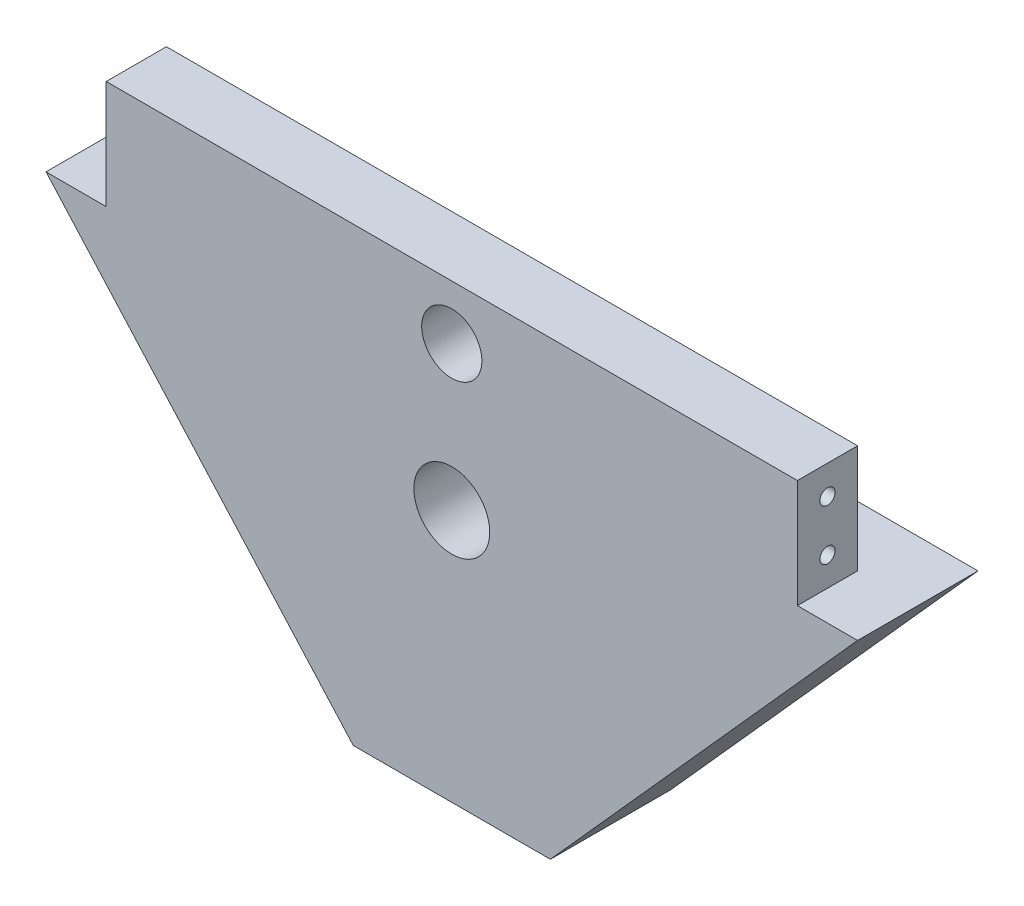
ISO-10303-21;
HEADER;
FILE_DESCRIPTION(('STEP AP214'),'2;1');
FILE_NAME('part.step','',(''),(''),'','','');
FILE_SCHEMA(('AUTOMOTIVE_DESIGN { 1 0 10303 214 1 1 1 1 }'));
ENDSEC;
DATA;
#1=APPLICATION_CONTEXT('core data for automotive mechanical design processes');
#2=APPLICATION_PROTOCOL_DEFINITION('international standard','automotive_design',2000,#1);
#3=PRODUCT_CONTEXT('',#1,'mechanical');
#4=PRODUCT('Part','Part','',(#3));
#5=PRODUCT_RELATED_PRODUCT_CATEGORY('part','',(#4));
#6=PRODUCT_DEFINITION_FORMATION('','',#4);
#7=PRODUCT_DEFINITION_CONTEXT('part definition',#1,'design');
#8=PRODUCT_DEFINITION('design','',#6,#7);
#9=PRODUCT_DEFINITION_SHAPE('','',#8);
#10=(LENGTH_UNIT() NAMED_UNIT(*) SI_UNIT(.MILLI.,.METRE.));
#11=(NAMED_UNIT(*) PLANE_ANGLE_UNIT() SI_UNIT($,.RADIAN.));
#12=(NAMED_UNIT(*) SI_UNIT($,.STERADIAN.) SOLID_ANGLE_UNIT());
#13=UNCERTAINTY_MEASURE_WITH_UNIT(LENGTH_MEASURE(1.E-05),#10,'distance_accuracy_value','');
#14=(GEOMETRIC_REPRESENTATION_CONTEXT(3) GLOBAL_UNCERTAINTY_ASSIGNED_CONTEXT((#13)) GLOBAL_UNIT_ASSIGNED_CONTEXT((#10,
#11,#12)) REPRESENTATION_CONTEXT('',''));
#15=CARTESIAN_POINT('',(0.,0.,0.));
#16=DIRECTION('',(0.,0.,1.));
#17=DIRECTION('',(1.,0.,0.));
#18=AXIS2_PLACEMENT_3D('',#15,#16,#17);
#19=CARTESIAN_POINT('',(-42.8001305488663,5.715,-12.7));
#20=DIRECTION('',(0.,1.,0.));
#21=DIRECTION('',(-1.,0.,0.));
#22=AXIS2_PLACEMENT_3D('',#19,#20,#21);
#23=PLANE('',#22);
#24=DIRECTION('',(0.,0.,-1.));
#25=VECTOR('',#24,1.);
#26=CARTESIAN_POINT('',(36.4501305488663,5.71500000000001,0.));
#27=LINE('',#26,#25);
#28=CARTESIAN_POINT('',(36.4501305488663,5.71500000000001,0.));
#29=VERTEX_POINT('',#28);
#30=CARTESIAN_POINT('',(36.4501305488663,5.71500000000001,-6.35));
#31=VERTEX_POINT('',#30);
#32=EDGE_CURVE('E168',#29,#31,#27,.T.);
#33=ORIENTED_EDGE('',*,*,#32,.T.);
#34=DIRECTION('',(1.,0.,0.));
#35=VECTOR('',#34,1.);
#36=CARTESIAN_POINT('',(-42.8001305488663,5.71500000000011,-6.35));
#37=LINE('',#36,#35);
#38=CARTESIAN_POINT('',(-36.4501305488663,5.71500000000001,-6.35));
#39=VERTEX_POINT('',#38);
#40=EDGE_CURVE('E186',#39,#31,#37,.T.);
#41=ORIENTED_EDGE('',*,*,#40,.F.);
#42=DIRECTION('',(0.,0.,-1.));
#43=VECTOR('',#42,1.);
#44=CARTESIAN_POINT('',(-36.4501305488663,5.71500000000001,0.));
#45=LINE('',#44,#43);
#46=CARTESIAN_POINT('',(-36.4501305488663,5.71500000000001,0.));
#47=VERTEX_POINT('',#46);
#48=EDGE_CURVE('E179',#47,#39,#45,.T.);
#49=ORIENTED_EDGE('',*,*,#48,.F.);
#50=DIRECTION('',(-1.,0.,0.));
#51=VECTOR('',#50,1.);
#52=CARTESIAN_POINT('',(-42.8001305488663,5.715,0.));
#53=LINE('',#52,#51);
#54=EDGE_CURVE('E204',#29,#47,#53,.T.);
#55=ORIENTED_EDGE('',*,*,#54,.F.);
#56=EDGE_LOOP('',(#33,#41,#49,#55));
#57=FACE_BOUND('',#56,.T.);
#58=ADVANCED_FACE('F44',(#57),#23,.T.);
#59=CARTESIAN_POINT('',(10.395398020278,-41.91,-12.7));
#60=DIRECTION('',(0.745039441543224,-0.667020412390026,0.));
#61=DIRECTION('',(0.667020412390026,0.745039441543224,0.));
#62=AXIS2_PLACEMENT_3D('',#59,#60,#61);
#63=PLANE('',#62);
#64=DIRECTION('',(0.667020412390026,0.745039441543224,0.));
#65=VECTOR('',#64,1.);
#66=CARTESIAN_POINT('',(10.395398020278,-41.91,0.));
#67=LINE('',#66,#65);
#68=CARTESIAN_POINT('',(10.395398020278,-41.91,0.));
#69=VERTEX_POINT('',#68);
#70=CARTESIAN_POINT('',(42.8001305488663,-5.71500000000001,0.));
#71=VERTEX_POINT('',#70);
#72=EDGE_CURVE('E215',#69,#71,#67,.T.);
#73=ORIENTED_EDGE('',*,*,#72,.F.);
#74=DIRECTION('',(0.,0.,1.));
#75=VECTOR('',#74,1.);
#76=CARTESIAN_POINT('',(10.395398020278,-41.91,-12.7));
#77=LINE('',#76,#75);
#78=CARTESIAN_POINT('',(10.395398020278,-41.91,-12.7));
#79=VERTEX_POINT('',#78);
#80=EDGE_CURVE('E53',#79,#69,#77,.T.);
#81=ORIENTED_EDGE('',*,*,#80,.F.);
#82=DIRECTION('',(0.667020412390026,0.745039441543224,0.));
#83=VECTOR('',#82,1.);
#84=CARTESIAN_POINT('',(10.395398020278,-41.91,-12.7));
#85=LINE('',#84,#83);
#86=CARTESIAN_POINT('',(42.8001305488663,-5.71500000000002,-12.7));
#87=VERTEX_POINT('',#86);
#88=EDGE_CURVE('E206',#79,#87,#85,.T.);
#89=ORIENTED_EDGE('',*,*,#88,.T.);
#90=DIRECTION('',(0.,0.,1.));
#91=VECTOR('',#90,1.);
#92=CARTESIAN_POINT('',(42.8001305488663,-5.71500000000002,-12.7));
#93=LINE('',#92,#91);
#94=EDGE_CURVE('E11',#87,#71,#93,.T.);
#95=ORIENTED_EDGE('',*,*,#94,.T.);
#96=EDGE_LOOP('',(#73,#81,#89,#95));
#97=FACE_BOUND('',#96,.T.);
#98=ADVANCED_FACE('F231',(#97),#63,.T.);
#99=CARTESIAN_POINT('',(-10.395398020278,-41.91,-12.7));
#100=DIRECTION('',(0.,-1.,0.));
#101=DIRECTION('',(0.,0.,-1.));
#102=AXIS2_PLACEMENT_3D('',#99,#100,#101);
#103=PLANE('',#102);
#104=DIRECTION('',(1.,0.,0.));
#105=VECTOR('',#104,1.);
#106=CARTESIAN_POINT('',(-10.395398020278,-41.91,0.));
#107=LINE('',#106,#105);
#108=CARTESIAN_POINT('',(-10.395398020278,-41.91,0.));
#109=VERTEX_POINT('',#108);
#110=EDGE_CURVE('E212',#109,#69,#107,.T.);
#111=ORIENTED_EDGE('',*,*,#110,.F.);
#112=DIRECTION('',(0.,0.,1.));
#113=VECTOR('',#112,1.);
#114=CARTESIAN_POINT('',(-10.395398020278,-41.91,-12.7));
#115=LINE('',#114,#113);
#116=CARTESIAN_POINT('',(-10.395398020278,-41.91,-12.7));
#117=VERTEX_POINT('',#116);
#118=EDGE_CURVE('E85',#117,#109,#115,.T.);
#119=ORIENTED_EDGE('',*,*,#118,.F.);
#120=DIRECTION('',(1.,0.,0.));
#121=VECTOR('',#120,1.);
#122=CARTESIAN_POINT('',(-10.395398020278,-41.91,-12.7));
#123=LINE('',#122,#121);
#124=EDGE_CURVE('E203',#117,#79,#123,.T.);
#125=ORIENTED_EDGE('',*,*,#124,.T.);
#126=ORIENTED_EDGE('',*,*,#80,.T.);
#127=EDGE_LOOP('',(#111,#119,#125,#126));
#128=FACE_BOUND('',#127,.T.);
#129=ADVANCED_FACE('F229',(#128),#103,.T.);
#130=CARTESIAN_POINT('',(-42.8001305488663,-5.71500000000003,-12.7));
#131=DIRECTION('',(-0.745039441543224,-0.667020412390026,0.));
#132=DIRECTION('',(0.667020412390026,-0.745039441543224,0.));
#133=AXIS2_PLACEMENT_3D('',#130,#131,#132);
#134=PLANE('',#133);
#135=DIRECTION('',(0.667020412390026,-0.745039441543224,0.));
#136=VECTOR('',#135,1.);
#137=CARTESIAN_POINT('',(-42.8001305488663,-5.71500000000003,0.));
#138=LINE('',#137,#136);
#139=CARTESIAN_POINT('',(-42.8001305488663,-5.71499999999993,0.));
#140=VERTEX_POINT('',#139);
#141=EDGE_CURVE('E199',#140,#109,#138,.T.);
#142=ORIENTED_EDGE('',*,*,#141,.F.);
#143=DIRECTION('',(0.,0.,1.));
#144=VECTOR('',#143,1.);
#145=CARTESIAN_POINT('',(-42.8001305488663,-5.71500000000003,-12.7));
#146=LINE('',#145,#144);
#147=CARTESIAN_POINT('',(-42.8001305488663,-5.71499999999991,-12.7));
#148=VERTEX_POINT('',#147);
#149=EDGE_CURVE('E209',#148,#140,#146,.T.);
#150=ORIENTED_EDGE('',*,*,#149,.F.);
#151=DIRECTION('',(0.667020412390026,-0.745039441543224,0.));
#152=VECTOR('',#151,1.);
#153=CARTESIAN_POINT('',(-42.8001305488663,-5.71500000000003,-12.7));
#154=LINE('',#153,#152);
#155=EDGE_CURVE('E200',#148,#117,#154,.T.);
#156=ORIENTED_EDGE('',*,*,#155,.T.);
#157=ORIENTED_EDGE('',*,*,#118,.T.);
#158=EDGE_LOOP('',(#142,#150,#156,#157));
#159=FACE_BOUND('',#158,.T.);
#160=ADVANCED_FACE('F46',(#159),#134,.T.);
#161=CARTESIAN_POINT('',(0.,0.,-12.7));
#162=DIRECTION('',(0.,0.,-1.));
#163=DIRECTION('',(-1.,0.,0.));
#164=AXIS2_PLACEMENT_3D('',#161,#162,#163);
#165=PLANE('',#164);
#166=CARTESIAN_POINT('',(0.,-15.24,-12.7));
#167=DIRECTION('',(0.,0.,1.));
#168=DIRECTION('',(1.,0.,0.));
#169=AXIS2_PLACEMENT_3D('',#166,#167,#168);
#170=CIRCLE('',#169,4.);
#171=CARTESIAN_POINT('',(4.,-15.24,-12.7));
#172=VERTEX_POINT('',#171);
#173=EDGE_CURVE('E183',#172,#172,#170,.T.);
#174=ORIENTED_EDGE('',*,*,#173,.T.);
#175=EDGE_LOOP('',(#174));
#176=FACE_BOUND('',#175,.T.);
#177=DIRECTION('',(1.,0.,0.));
#178=VECTOR('',#177,1.);
#179=CARTESIAN_POINT('',(-42.8001305488663,-5.71499999999991,-12.7));
#180=LINE('',#179,#178);
#181=EDGE_CURVE('E189',#148,#87,#180,.T.);
#182=ORIENTED_EDGE('',*,*,#181,.T.);
#183=ORIENTED_EDGE('',*,*,#88,.F.);
#184=ORIENTED_EDGE('',*,*,#124,.F.);
#185=ORIENTED_EDGE('',*,*,#155,.F.);
#186=EDGE_LOOP('',(#182,#183,#184,#185));
#187=FACE_BOUND('',#186,.T.);
#188=ADVANCED_FACE('F258',(#176,#187),#165,.T.);
#189=CARTESIAN_POINT('',(0.,0.,0.));
#190=DIRECTION('',(0.,0.,-1.));
#191=DIRECTION('',(-1.,0.,0.));
#192=AXIS2_PLACEMENT_3D('',#189,#190,#191);
#193=PLANE('',#192);
#194=CARTESIAN_POINT('',(0.,-15.24,0.));
#195=DIRECTION('',(0.,0.,1.));
#196=DIRECTION('',(1.,0.,0.));
#197=AXIS2_PLACEMENT_3D('',#194,#195,#196);
#198=CIRCLE('',#197,4.);
#199=CARTESIAN_POINT('',(4.,-15.24,0.));
#200=VERTEX_POINT('',#199);
#201=EDGE_CURVE('E171',#200,#200,#198,.T.);
#202=ORIENTED_EDGE('',*,*,#201,.F.);
#203=EDGE_LOOP('',(#202));
#204=FACE_BOUND('',#203,.T.);
#205=CARTESIAN_POINT('',(0.,0.,0.));
#206=DIRECTION('',(0.,0.,1.));
#207=DIRECTION('',(1.,0.,0.));
#208=AXIS2_PLACEMENT_3D('',#205,#206,#207);
#209=CIRCLE('',#208,3.175);
#210=CARTESIAN_POINT('',(3.175,0.,0.));
#211=VERTEX_POINT('',#210);
#212=EDGE_CURVE('E196',#211,#211,#209,.T.);
#213=ORIENTED_EDGE('',*,*,#212,.F.);
#214=EDGE_LOOP('',(#213));
#215=FACE_BOUND('',#214,.T.);
#216=DIRECTION('',(-1.,0.,0.));
#217=VECTOR('',#216,1.);
#218=CARTESIAN_POINT('',(42.8001305488663,-5.71500000000001,0.));
#219=LINE('',#218,#217);
#220=CARTESIAN_POINT('',(36.4501305488663,-5.71499999999992,0.));
#221=VERTEX_POINT('',#220);
#222=EDGE_CURVE('E158',#71,#221,#219,.T.);
#223=ORIENTED_EDGE('',*,*,#222,.T.);
#224=DIRECTION('',(0.,1.,0.));
#225=VECTOR('',#224,1.);
#226=CARTESIAN_POINT('',(36.4501305488663,5.71500000000001,0.));
#227=LINE('',#226,#225);
#228=EDGE_CURVE('E161',#221,#29,#227,.T.);
#229=ORIENTED_EDGE('',*,*,#228,.T.);
#230=ORIENTED_EDGE('',*,*,#54,.T.);
#231=DIRECTION('',(0.,-1.,0.));
#232=VECTOR('',#231,1.);
#233=CARTESIAN_POINT('',(-36.4501305488663,5.71500000000001,0.));
#234=LINE('',#233,#232);
#235=CARTESIAN_POINT('',(-36.4501305488663,-5.71499999999992,0.));
#236=VERTEX_POINT('',#235);
#237=EDGE_CURVE('E173',#47,#236,#234,.T.);
#238=ORIENTED_EDGE('',*,*,#237,.T.);
#239=DIRECTION('',(-1.,0.,0.));
#240=VECTOR('',#239,1.);
#241=CARTESIAN_POINT('',(-42.8001305488663,-5.71499999999993,0.));
#242=LINE('',#241,#240);
#243=EDGE_CURVE('E176',#236,#140,#242,.T.);
#244=ORIENTED_EDGE('',*,*,#243,.T.);
#245=ORIENTED_EDGE('',*,*,#141,.T.);
#246=ORIENTED_EDGE('',*,*,#110,.T.);
#247=ORIENTED_EDGE('',*,*,#72,.T.);
#248=EDGE_LOOP('',(#223,#229,#230,#238,#244,#245,#246,#247));
#249=FACE_BOUND('',#248,.T.);
#250=ADVANCED_FACE('F228',(#204,#215,#249),#193,.F.);
#251=CARTESIAN_POINT('',(0.,0.,-12.7));
#252=DIRECTION('',(0.,0.,1.));
#253=DIRECTION('',(1.,0.,0.));
#254=AXIS2_PLACEMENT_3D('',#251,#252,#253);
#255=CYLINDRICAL_SURFACE('',#254,3.175);
#256=CARTESIAN_POINT('',(0.,0.,-6.35));
#257=DIRECTION('',(0.,0.,1.));
#258=DIRECTION('',(0.,-1.,0.));
#259=AXIS2_PLACEMENT_3D('',#256,#257,#258);
#260=CIRCLE('',#259,3.175);
#261=CARTESIAN_POINT('',(0.,-3.175,-6.35));
#262=VERTEX_POINT('',#261);
#263=EDGE_CURVE('E48',#262,#262,#260,.F.);
#264=ORIENTED_EDGE('',*,*,#263,.T.);
#265=EDGE_LOOP('',(#264));
#266=FACE_BOUND('',#265,.T.);
#267=ORIENTED_EDGE('',*,*,#212,.T.);
#268=EDGE_LOOP('',(#267));
#269=FACE_BOUND('',#268,.T.);
#270=ADVANCED_FACE('F247',(#266,#269),#255,.F.);
#271=CARTESIAN_POINT('',(-42.8001305488663,5.71500000000011,-6.35));
#272=DIRECTION('',(0.,0.,1.));
#273=DIRECTION('',(0.,-1.,0.));
#274=AXIS2_PLACEMENT_3D('',#271,#272,#273);
#275=PLANE('',#274);
#276=ORIENTED_EDGE('',*,*,#40,.T.);
#277=DIRECTION('',(0.,1.,0.));
#278=VECTOR('',#277,1.);
#279=CARTESIAN_POINT('',(36.4501305488663,5.71500000000001,-6.35));
#280=LINE('',#279,#278);
#281=CARTESIAN_POINT('',(36.4501305488663,-5.71499999999991,-6.35));
#282=VERTEX_POINT('',#281);
#283=EDGE_CURVE('E162',#282,#31,#280,.T.);
#284=ORIENTED_EDGE('',*,*,#283,.F.);
#285=DIRECTION('',(1.,0.,0.));
#286=VECTOR('',#285,1.);
#287=CARTESIAN_POINT('',(-42.8001305488663,-5.71499999999991,-6.35));
#288=LINE('',#287,#286);
#289=CARTESIAN_POINT('',(-36.4501305488663,-5.71499999999992,-6.35));
#290=VERTEX_POINT('',#289);
#291=EDGE_CURVE('E191',#290,#282,#288,.T.);
#292=ORIENTED_EDGE('',*,*,#291,.F.);
#293=DIRECTION('',(0.,-1.,0.));
#294=VECTOR('',#293,1.);
#295=CARTESIAN_POINT('',(-36.4501305488663,5.71500000000001,-6.35));
#296=LINE('',#295,#294);
#297=EDGE_CURVE('E61',#39,#290,#296,.T.);
#298=ORIENTED_EDGE('',*,*,#297,.F.);
#299=EDGE_LOOP('',(#276,#284,#292,#298));
#300=FACE_BOUND('',#299,.T.);
#301=ORIENTED_EDGE('',*,*,#263,.F.);
#302=EDGE_LOOP('',(#301));
#303=FACE_BOUND('',#302,.T.);
#304=ADVANCED_FACE('F244',(#300,#303),#275,.F.);
#305=CARTESIAN_POINT('',(-42.8001305488663,-5.71499999999991,-12.7));
#306=DIRECTION('',(0.,-1.,0.));
#307=DIRECTION('',(1.,0.,0.));
#308=AXIS2_PLACEMENT_3D('',#305,#306,#307);
#309=PLANE('',#308);
#310=ORIENTED_EDGE('',*,*,#94,.F.);
#311=ORIENTED_EDGE('',*,*,#181,.F.);
#312=ORIENTED_EDGE('',*,*,#149,.T.);
#313=ORIENTED_EDGE('',*,*,#243,.F.);
#314=DIRECTION('',(0.,0.,-1.));
#315=VECTOR('',#314,1.);
#316=CARTESIAN_POINT('',(-36.4501305488663,-5.71499999999992,0.));
#317=LINE('',#316,#315);
#318=EDGE_CURVE('E167',#236,#290,#317,.T.);
#319=ORIENTED_EDGE('',*,*,#318,.T.);
#320=ORIENTED_EDGE('',*,*,#291,.T.);
#321=DIRECTION('',(0.,0.,-1.));
#322=VECTOR('',#321,1.);
#323=CARTESIAN_POINT('',(36.4501305488663,-5.71499999999992,0.));
#324=LINE('',#323,#322);
#325=EDGE_CURVE('E165',#221,#282,#324,.T.);
#326=ORIENTED_EDGE('',*,*,#325,.F.);
#327=ORIENTED_EDGE('',*,*,#222,.F.);
#328=EDGE_LOOP('',(#310,#311,#312,#313,#319,#320,#326,#327));
#329=FACE_BOUND('',#328,.T.);
#330=ADVANCED_FACE('F223',(#329),#309,.F.);
#331=CARTESIAN_POINT('',(0.,-15.24,-12.7));
#332=DIRECTION('',(0.,0.,1.));
#333=DIRECTION('',(1.,0.,0.));
#334=AXIS2_PLACEMENT_3D('',#331,#332,#333);
#335=CYLINDRICAL_SURFACE('',#334,4.);
#336=ORIENTED_EDGE('',*,*,#173,.F.);
#337=EDGE_LOOP('',(#336));
#338=FACE_BOUND('',#337,.T.);
#339=ORIENTED_EDGE('',*,*,#201,.T.);
#340=EDGE_LOOP('',(#339));
#341=FACE_BOUND('',#340,.T.);
#342=ADVANCED_FACE('F324',(#338,#341),#335,.F.);
#343=CARTESIAN_POINT('',(-36.4501305488663,5.71500000000001,0.));
#344=DIRECTION('',(1.,0.,0.));
#345=DIRECTION('',(0.,0.,-1.));
#346=AXIS2_PLACEMENT_3D('',#343,#344,#345);
#347=PLANE('',#346);
#348=CARTESIAN_POINT('',(-36.4501305488663,2.66700000000001,-3.175));
#349=DIRECTION('',(-1.,0.,0.));
#350=DIRECTION('',(0.,0.,1.));
#351=AXIS2_PLACEMENT_3D('',#348,#349,#350);
#352=CIRCLE('',#351,0.79999999999999);
#353=CARTESIAN_POINT('',(-36.4501305488663,2.66700000000001,-2.37500000000001));
#354=VERTEX_POINT('',#353);
#355=EDGE_CURVE('E146',#354,#354,#352,.T.);
#356=ORIENTED_EDGE('',*,*,#355,.F.);
#357=EDGE_LOOP('',(#356));
#358=FACE_BOUND('',#357,.T.);
#359=CARTESIAN_POINT('',(-36.4501305488663,-2.66699999999992,-3.175));
#360=DIRECTION('',(-1.,0.,0.));
#361=DIRECTION('',(0.,0.,1.));
#362=AXIS2_PLACEMENT_3D('',#359,#360,#361);
#363=CIRCLE('',#362,0.79999999999999);
#364=CARTESIAN_POINT('',(-36.4501305488663,-2.66699999999992,-2.37500000000001));
#365=VERTEX_POINT('',#364);
#366=EDGE_CURVE('E152',#365,#365,#363,.T.);
#367=ORIENTED_EDGE('',*,*,#366,.F.);
#368=EDGE_LOOP('',(#367));
#369=FACE_BOUND('',#368,.T.);
#370=ORIENTED_EDGE('',*,*,#297,.T.);
#371=ORIENTED_EDGE('',*,*,#318,.F.);
#372=ORIENTED_EDGE('',*,*,#237,.F.);
#373=ORIENTED_EDGE('',*,*,#48,.T.);
#374=EDGE_LOOP('',(#370,#371,#372,#373));
#375=FACE_BOUND('',#374,.T.);
#376=ADVANCED_FACE('F242',(#358,#369,#375),#347,.F.);
#377=CARTESIAN_POINT('',(36.4501305488663,5.71500000000001,0.));
#378=DIRECTION('',(-1.,0.,0.));
#379=DIRECTION('',(0.,-1.,0.));
#380=AXIS2_PLACEMENT_3D('',#377,#378,#379);
#381=PLANE('',#380);
#382=CARTESIAN_POINT('',(36.4501305488663,2.66700000000003,-3.175));
#383=DIRECTION('',(1.,0.,0.));
#384=DIRECTION('',(0.,0.,-1.));
#385=AXIS2_PLACEMENT_3D('',#382,#383,#384);
#386=CIRCLE('',#385,0.79999999999999);
#387=CARTESIAN_POINT('',(36.4501305488663,2.66700000000003,-3.97499999999999));
#388=VERTEX_POINT('',#387);
#389=EDGE_CURVE('E136',#388,#388,#386,.T.);
#390=ORIENTED_EDGE('',*,*,#389,.F.);
#391=EDGE_LOOP('',(#390));
#392=FACE_BOUND('',#391,.T.);
#393=CARTESIAN_POINT('',(36.4501305488663,-2.6669999999999,-3.175));
#394=DIRECTION('',(1.,0.,0.));
#395=DIRECTION('',(0.,0.,-1.));
#396=AXIS2_PLACEMENT_3D('',#393,#394,#395);
#397=CIRCLE('',#396,0.79999999999999);
#398=CARTESIAN_POINT('',(36.4501305488663,-2.6669999999999,-3.97499999999999));
#399=VERTEX_POINT('',#398);
#400=EDGE_CURVE('E135',#399,#399,#397,.T.);
#401=ORIENTED_EDGE('',*,*,#400,.F.);
#402=EDGE_LOOP('',(#401));
#403=FACE_BOUND('',#402,.T.);
#404=ORIENTED_EDGE('',*,*,#283,.T.);
#405=ORIENTED_EDGE('',*,*,#32,.F.);
#406=ORIENTED_EDGE('',*,*,#228,.F.);
#407=ORIENTED_EDGE('',*,*,#325,.T.);
#408=EDGE_LOOP('',(#404,#405,#406,#407));
#409=FACE_BOUND('',#408,.T.);
#410=ADVANCED_FACE('F237',(#392,#403,#409),#381,.F.);
#411=CARTESIAN_POINT('',(-31.1161305488663,-2.66699999999992,-3.175));
#412=DIRECTION('',(-1.,0.,0.));
#413=DIRECTION('',(0.,0.,1.));
#414=AXIS2_PLACEMENT_3D('',#411,#412,#413);
#415=CONICAL_SURFACE('',#414,0.799999999999988,1.02974425867665);
#416=CARTESIAN_POINT('',(-30.6354420536443,-2.66699999999992,-3.175));
#417=VERTEX_POINT('',#416);
#418=VERTEX_LOOP('',#417);
#419=FACE_BOUND('',#418,.T.);
#420=CARTESIAN_POINT('',(-31.1161305488663,-2.66699999999992,-3.175));
#421=DIRECTION('',(-1.,0.,0.));
#422=DIRECTION('',(0.,0.,1.));
#423=AXIS2_PLACEMENT_3D('',#420,#421,#422);
#424=CIRCLE('',#423,0.799999999999988);
#425=CARTESIAN_POINT('',(-31.1161305488663,-2.66699999999992,-2.37500000000001));
#426=VERTEX_POINT('',#425);
#427=EDGE_CURVE('E155',#426,#426,#424,.T.);
#428=ORIENTED_EDGE('',*,*,#427,.T.);
#429=EDGE_LOOP('',(#428));
#430=FACE_BOUND('',#429,.T.);
#431=ADVANCED_FACE('F352',(#419,#430),#415,.F.);
#432=CARTESIAN_POINT('',(-36.4501305488663,-2.66699999999992,-3.175));
#433=DIRECTION('',(-1.,0.,0.));
#434=DIRECTION('',(0.,0.,1.));
#435=AXIS2_PLACEMENT_3D('',#432,#433,#434);
#436=CYLINDRICAL_SURFACE('',#435,0.799999999999989);
#437=ORIENTED_EDGE('',*,*,#427,.F.);
#438=EDGE_LOOP('',(#437));
#439=FACE_BOUND('',#438,.T.);
#440=ORIENTED_EDGE('',*,*,#366,.T.);
#441=EDGE_LOOP('',(#440));
#442=FACE_BOUND('',#441,.T.);
#443=ADVANCED_FACE('F362',(#439,#442),#436,.F.);
#444=CARTESIAN_POINT('',(-31.1161305488663,2.66700000000001,-3.175));
#445=DIRECTION('',(-1.,0.,0.));
#446=DIRECTION('',(0.,0.,1.));
#447=AXIS2_PLACEMENT_3D('',#444,#445,#446);
#448=CONICAL_SURFACE('',#447,0.799999999999988,1.02974425867665);
#449=CARTESIAN_POINT('',(-30.6354420536443,2.66700000000001,-3.175));
#450=VERTEX_POINT('',#449);
#451=VERTEX_LOOP('',#450);
#452=FACE_BOUND('',#451,.T.);
#453=CARTESIAN_POINT('',(-31.1161305488663,2.66700000000001,-3.175));
#454=DIRECTION('',(-1.,0.,0.));
#455=DIRECTION('',(0.,0.,1.));
#456=AXIS2_PLACEMENT_3D('',#453,#454,#455);
#457=CIRCLE('',#456,0.799999999999988);
#458=CARTESIAN_POINT('',(-31.1161305488663,2.66700000000001,-2.37500000000001));
#459=VERTEX_POINT('',#458);
#460=EDGE_CURVE('E149',#459,#459,#457,.T.);
#461=ORIENTED_EDGE('',*,*,#460,.T.);
#462=EDGE_LOOP('',(#461));
#463=FACE_BOUND('',#462,.T.);
#464=ADVANCED_FACE('F370',(#452,#463),#448,.F.);
#465=CARTESIAN_POINT('',(-36.4501305488663,2.66700000000001,-3.175));
#466=DIRECTION('',(-1.,0.,0.));
#467=DIRECTION('',(0.,0.,1.));
#468=AXIS2_PLACEMENT_3D('',#465,#466,#467);
#469=CYLINDRICAL_SURFACE('',#468,0.799999999999989);
#470=ORIENTED_EDGE('',*,*,#460,.F.);
#471=EDGE_LOOP('',(#470));
#472=FACE_BOUND('',#471,.T.);
#473=ORIENTED_EDGE('',*,*,#355,.T.);
#474=EDGE_LOOP('',(#473));
#475=FACE_BOUND('',#474,.T.);
#476=ADVANCED_FACE('F379',(#472,#475),#469,.F.);
#477=CARTESIAN_POINT('',(31.1161305488663,-2.6669999999999,-3.175));
#478=DIRECTION('',(1.,0.,0.));
#479=DIRECTION('',(0.,0.,-1.));
#480=AXIS2_PLACEMENT_3D('',#477,#478,#479);
#481=CONICAL_SURFACE('',#480,0.799999999999988,1.02974425867665);
#482=CARTESIAN_POINT('',(30.6354420536443,-2.6669999999999,-3.175));
#483=VERTEX_POINT('',#482);
#484=VERTEX_LOOP('',#483);
#485=FACE_BOUND('',#484,.T.);
#486=CARTESIAN_POINT('',(31.1161305488663,-2.6669999999999,-3.175));
#487=DIRECTION('',(1.,0.,0.));
#488=DIRECTION('',(0.,0.,-1.));
#489=AXIS2_PLACEMENT_3D('',#486,#487,#488);
#490=CIRCLE('',#489,0.799999999999988);
#491=CARTESIAN_POINT('',(31.1161305488663,-2.6669999999999,-3.97499999999998));
#492=VERTEX_POINT('',#491);
#493=EDGE_CURVE('E139',#492,#492,#490,.T.);
#494=ORIENTED_EDGE('',*,*,#493,.T.);
#495=EDGE_LOOP('',(#494));
#496=FACE_BOUND('',#495,.T.);
#497=ADVANCED_FACE('F386',(#485,#496),#481,.F.);
#498=CARTESIAN_POINT('',(36.4501305488663,-2.6669999999999,-3.175));
#499=DIRECTION('',(1.,0.,0.));
#500=DIRECTION('',(0.,0.,-1.));
#501=AXIS2_PLACEMENT_3D('',#498,#499,#500);
#502=CYLINDRICAL_SURFACE('',#501,0.799999999999989);
#503=ORIENTED_EDGE('',*,*,#493,.F.);
#504=EDGE_LOOP('',(#503));
#505=FACE_BOUND('',#504,.T.);
#506=ORIENTED_EDGE('',*,*,#400,.T.);
#507=EDGE_LOOP('',(#506));
#508=FACE_BOUND('',#507,.T.);
#509=ADVANCED_FACE('F129',(#505,#508),#502,.F.);
#510=CARTESIAN_POINT('',(31.1161305488663,2.66700000000003,-3.175));
#511=DIRECTION('',(1.,0.,0.));
#512=DIRECTION('',(0.,0.,-1.));
#513=AXIS2_PLACEMENT_3D('',#510,#511,#512);
#514=CONICAL_SURFACE('',#513,0.799999999999988,1.02974425867665);
#515=CARTESIAN_POINT('',(30.6354420536443,2.66700000000003,-3.175));
#516=VERTEX_POINT('',#515);
#517=VERTEX_LOOP('',#516);
#518=FACE_BOUND('',#517,.T.);
#519=CARTESIAN_POINT('',(31.1161305488663,2.66700000000003,-3.175));
#520=DIRECTION('',(1.,0.,0.));
#521=DIRECTION('',(0.,0.,-1.));
#522=AXIS2_PLACEMENT_3D('',#519,#520,#521);
#523=CIRCLE('',#522,0.799999999999988);
#524=CARTESIAN_POINT('',(31.1161305488663,2.66700000000003,-3.97499999999998));
#525=VERTEX_POINT('',#524);
#526=EDGE_CURVE('E133',#525,#525,#523,.T.);
#527=ORIENTED_EDGE('',*,*,#526,.T.);
#528=EDGE_LOOP('',(#527));
#529=FACE_BOUND('',#528,.T.);
#530=ADVANCED_FACE('F125',(#518,#529),#514,.F.);
#531=CARTESIAN_POINT('',(36.4501305488663,2.66700000000003,-3.175));
#532=DIRECTION('',(1.,0.,0.));
#533=DIRECTION('',(0.,0.,-1.));
#534=AXIS2_PLACEMENT_3D('',#531,#532,#533);
#535=CYLINDRICAL_SURFACE('',#534,0.799999999999989);
#536=ORIENTED_EDGE('',*,*,#526,.F.);
#537=EDGE_LOOP('',(#536));
#538=FACE_BOUND('',#537,.T.);
#539=ORIENTED_EDGE('',*,*,#389,.T.);
#540=EDGE_LOOP('',(#539));
#541=FACE_BOUND('',#540,.T.);
#542=ADVANCED_FACE('F128',(#538,#541),#535,.F.);
#543=CLOSED_SHELL('',(#58,#98,#129,#160,#188,#250,#270,#304,#330,#342,#376,#410,#431,#443,#464,
#476,#497,#509,#530,#542));
#544=MANIFOLD_SOLID_BREP('B2',#543);
#545=ADVANCED_BREP_SHAPE_REPRESENTATION('',(#18,#544),#14);
#546=SHAPE_DEFINITION_REPRESENTATION(#9,#545);
ENDSEC;
END-ISO-10303-21;
